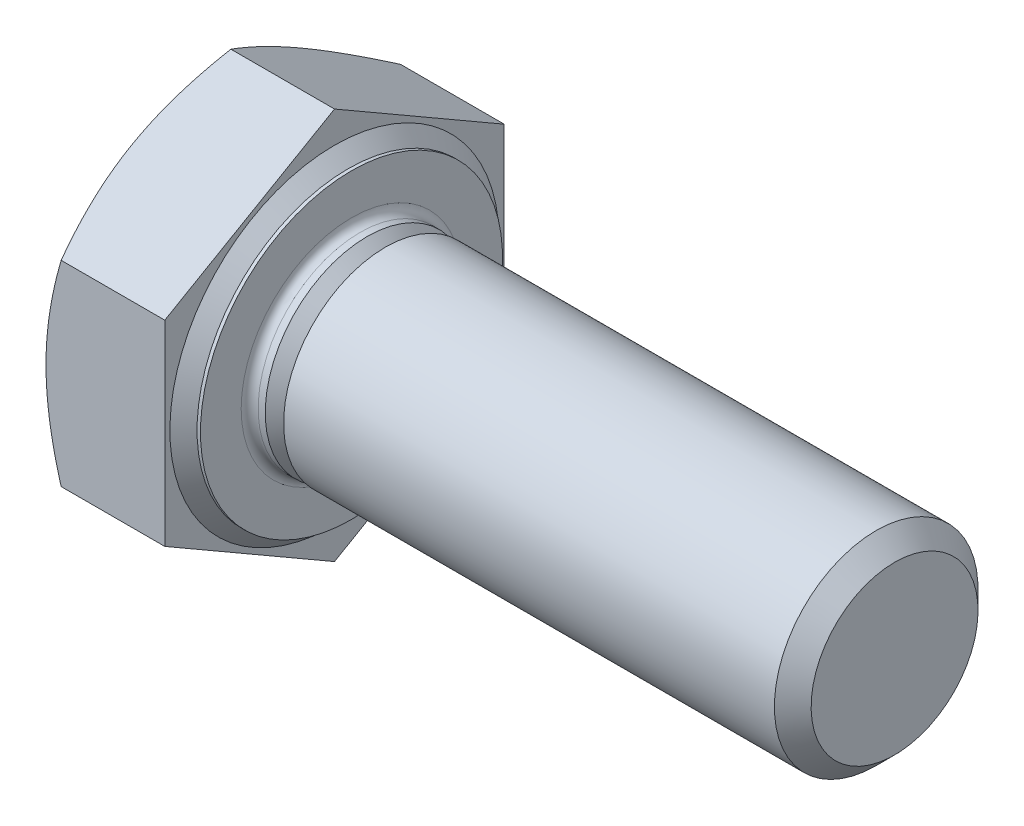
ISO-10303-21;
HEADER;
FILE_DESCRIPTION(('STEP AP214'),'2;1');
FILE_NAME('part.step','',(''),(''),'','','');
FILE_SCHEMA(('AUTOMOTIVE_DESIGN { 1 0 10303 214 1 1 1 1 }'));
ENDSEC;
DATA;
#1=APPLICATION_CONTEXT('core data for automotive mechanical design processes');
#2=APPLICATION_PROTOCOL_DEFINITION('international standard','automotive_design',2000,#1);
#3=PRODUCT_CONTEXT('',#1,'mechanical');
#4=PRODUCT('Part','Part','',(#3));
#5=PRODUCT_RELATED_PRODUCT_CATEGORY('part','',(#4));
#6=PRODUCT_DEFINITION_FORMATION('','',#4);
#7=PRODUCT_DEFINITION_CONTEXT('part definition',#1,'design');
#8=PRODUCT_DEFINITION('design','',#6,#7);
#9=PRODUCT_DEFINITION_SHAPE('','',#8);
#10=(LENGTH_UNIT() NAMED_UNIT(*) SI_UNIT(.MILLI.,.METRE.));
#11=(NAMED_UNIT(*) PLANE_ANGLE_UNIT() SI_UNIT($,.RADIAN.));
#12=(NAMED_UNIT(*) SI_UNIT($,.STERADIAN.) SOLID_ANGLE_UNIT());
#13=UNCERTAINTY_MEASURE_WITH_UNIT(LENGTH_MEASURE(1.E-05),#10,'distance_accuracy_value','');
#14=(GEOMETRIC_REPRESENTATION_CONTEXT(3) GLOBAL_UNCERTAINTY_ASSIGNED_CONTEXT((#13)) GLOBAL_UNIT_ASSIGNED_CONTEXT((#10,
#11,#12)) REPRESENTATION_CONTEXT('',''));
#15=CARTESIAN_POINT('',(0.,0.,0.));
#16=DIRECTION('',(0.,0.,1.));
#17=DIRECTION('',(1.,0.,0.));
#18=AXIS2_PLACEMENT_3D('',#15,#16,#17);
#19=CARTESIAN_POINT('',(0.,0.,0.));
#20=DIRECTION('',(-1.,0.,0.));
#21=DIRECTION('',(0.,0.,1.));
#22=AXIS2_PLACEMENT_3D('',#19,#20,#21);
#23=PLANE('',#22);
#24=DIRECTION('',(0.,-0.5,-0.866025403784439));
#25=VECTOR('',#24,1.);
#26=CARTESIAN_POINT('',(0.,5.77350269189626,0.));
#27=LINE('',#26,#25);
#28=CARTESIAN_POINT('',(0.,5.77350269189626,0.));
#29=VERTEX_POINT('',#28);
#30=CARTESIAN_POINT('',(0.,2.88675134594813,-5.));
#31=VERTEX_POINT('',#30);
#32=EDGE_CURVE('E11',#29,#31,#27,.T.);
#33=ORIENTED_EDGE('',*,*,#32,.F.);
#34=DIRECTION('',(0.,0.5,-0.866025403784439));
#35=VECTOR('',#34,1.);
#36=CARTESIAN_POINT('',(0.,2.88675134594813,5.));
#37=LINE('',#36,#35);
#38=CARTESIAN_POINT('',(0.,2.88675134594813,5.));
#39=VERTEX_POINT('',#38);
#40=EDGE_CURVE('E126',#39,#29,#37,.T.);
#41=ORIENTED_EDGE('',*,*,#40,.F.);
#42=DIRECTION('',(0.,1.,0.));
#43=VECTOR('',#42,1.);
#44=CARTESIAN_POINT('',(0.,-2.88675134594813,5.));
#45=LINE('',#44,#43);
#46=CARTESIAN_POINT('',(0.,-2.88675134594813,5.));
#47=VERTEX_POINT('',#46);
#48=EDGE_CURVE('E26',#47,#39,#45,.T.);
#49=ORIENTED_EDGE('',*,*,#48,.F.);
#50=DIRECTION('',(0.,0.5,0.866025403784439));
#51=VECTOR('',#50,1.);
#52=CARTESIAN_POINT('',(0.,-5.77350269189626,0.));
#53=LINE('',#52,#51);
#54=CARTESIAN_POINT('',(0.,-5.77350269189626,0.));
#55=VERTEX_POINT('',#54);
#56=EDGE_CURVE('E20',#55,#47,#53,.T.);
#57=ORIENTED_EDGE('',*,*,#56,.F.);
#58=DIRECTION('',(0.,-0.5,0.866025403784439));
#59=VECTOR('',#58,1.);
#60=CARTESIAN_POINT('',(0.,-2.88675134594812,-5.));
#61=LINE('',#60,#59);
#62=CARTESIAN_POINT('',(0.,-2.88675134594812,-5.));
#63=VERTEX_POINT('',#62);
#64=EDGE_CURVE('E192',#63,#55,#61,.T.);
#65=ORIENTED_EDGE('',*,*,#64,.F.);
#66=DIRECTION('',(0.,-1.,0.));
#67=VECTOR('',#66,1.);
#68=CARTESIAN_POINT('',(0.,2.88675134594813,-5.));
#69=LINE('',#68,#67);
#70=EDGE_CURVE('E160',#31,#63,#69,.T.);
#71=ORIENTED_EDGE('',*,*,#70,.F.);
#72=EDGE_LOOP('',(#33,#41,#49,#57,#65,#71));
#73=FACE_BOUND('',#72,.T.);
#74=CARTESIAN_POINT('',(0.,0.,0.));
#75=DIRECTION('',(-1.,0.,0.));
#76=DIRECTION('',(0.,1.,0.));
#77=AXIS2_PLACEMENT_3D('',#74,#75,#76);
#78=CIRCLE('',#77,4.85);
#79=CARTESIAN_POINT('',(0.,4.85,0.));
#80=VERTEX_POINT('',#79);
#81=EDGE_CURVE('E175',#80,#80,#78,.T.);
#82=ORIENTED_EDGE('',*,*,#81,.T.);
#83=EDGE_LOOP('',(#82));
#84=FACE_BOUND('',#83,.T.);
#85=ADVANCED_FACE('F16',(#73,#84),#23,.F.);
#86=CARTESIAN_POINT('',(-3.5,0.,0.));
#87=DIRECTION('',(-1.,0.,0.));
#88=DIRECTION('',(0.,0.,1.));
#89=AXIS2_PLACEMENT_3D('',#86,#87,#88);
#90=PLANE('',#89);
#91=CARTESIAN_POINT('',(-3.5,0.,0.));
#92=DIRECTION('',(1.,0.,0.));
#93=DIRECTION('',(0.,1.,0.));
#94=AXIS2_PLACEMENT_3D('',#91,#92,#93);
#95=CIRCLE('',#94,5.);
#96=CARTESIAN_POINT('',(-3.5,-4.3301270189222,-2.5));
#97=VERTEX_POINT('',#96);
#98=CARTESIAN_POINT('',(-3.5,0.,-5.));
#99=VERTEX_POINT('',#98);
#100=EDGE_CURVE('E183',#97,#99,#95,.T.);
#101=ORIENTED_EDGE('',*,*,#100,.F.);
#102=CARTESIAN_POINT('',(-3.5,0.,0.));
#103=DIRECTION('',(1.,0.,0.));
#104=DIRECTION('',(0.,1.,0.));
#105=AXIS2_PLACEMENT_3D('',#102,#103,#104);
#106=CIRCLE('',#105,5.);
#107=CARTESIAN_POINT('',(-3.5,-4.3301270189222,2.5));
#108=VERTEX_POINT('',#107);
#109=EDGE_CURVE('E149',#108,#97,#106,.T.);
#110=ORIENTED_EDGE('',*,*,#109,.F.);
#111=CARTESIAN_POINT('',(-3.5,0.,0.));
#112=DIRECTION('',(1.,0.,0.));
#113=DIRECTION('',(0.,1.,0.));
#114=AXIS2_PLACEMENT_3D('',#111,#112,#113);
#115=CIRCLE('',#114,5.);
#116=CARTESIAN_POINT('',(-3.5,0.,5.));
#117=VERTEX_POINT('',#116);
#118=EDGE_CURVE('E252',#117,#108,#115,.T.);
#119=ORIENTED_EDGE('',*,*,#118,.F.);
#120=CARTESIAN_POINT('',(-3.5,0.,0.));
#121=DIRECTION('',(1.,0.,0.));
#122=DIRECTION('',(0.,1.,0.));
#123=AXIS2_PLACEMENT_3D('',#120,#121,#122);
#124=CIRCLE('',#123,5.);
#125=CARTESIAN_POINT('',(-3.5,4.3301270189222,2.5));
#126=VERTEX_POINT('',#125);
#127=EDGE_CURVE('E167',#126,#117,#124,.T.);
#128=ORIENTED_EDGE('',*,*,#127,.F.);
#129=CARTESIAN_POINT('',(-3.5,0.,0.));
#130=DIRECTION('',(1.,0.,0.));
#131=DIRECTION('',(0.,1.,0.));
#132=AXIS2_PLACEMENT_3D('',#129,#130,#131);
#133=CIRCLE('',#132,5.);
#134=CARTESIAN_POINT('',(-3.5,4.3301270189222,-2.5));
#135=VERTEX_POINT('',#134);
#136=EDGE_CURVE('E197',#135,#126,#133,.T.);
#137=ORIENTED_EDGE('',*,*,#136,.F.);
#138=CARTESIAN_POINT('',(-3.5,0.,0.));
#139=DIRECTION('',(1.,0.,0.));
#140=DIRECTION('',(0.,1.,0.));
#141=AXIS2_PLACEMENT_3D('',#138,#139,#140);
#142=CIRCLE('',#141,5.);
#143=EDGE_CURVE('E103',#99,#135,#142,.T.);
#144=ORIENTED_EDGE('',*,*,#143,.F.);
#145=EDGE_LOOP('',(#101,#110,#119,#128,#137,#144));
#146=FACE_BOUND('',#145,.T.);
#147=ADVANCED_FACE('F304',(#146),#90,.T.);
#148=CARTESIAN_POINT('',(0.,4.3301270189222,-2.5));
#149=DIRECTION('',(0.,0.866025403784439,-0.5));
#150=DIRECTION('',(0.,-0.5,-0.866025403784439));
#151=AXIS2_PLACEMENT_3D('',#148,#149,#150);
#152=PLANE('',#151);
#153=CARTESIAN_POINT('',(-3.05255354137804,5.77499941813259,0.00259240588634483));
#154=CARTESIAN_POINT('',(-3.5,5.00060145011032,-1.33870422000633));
#155=CARTESIAN_POINT('',(-3.5,4.3301270189222,-2.5));
#156=CARTESIAN_POINT('',(-3.5,3.65965258773407,-3.66129577999367));
#157=CARTESIAN_POINT('',(-3.05255354137804,2.8852546197118,-5.00259240588634));
#158=(BOUNDED_CURVE() B_SPLINE_CURVE(2,(#153,#154,#155,#156,#157),.UNSPECIFIED.,.F.,
.F.) B_SPLINE_CURVE_WITH_KNOTS((3,2,3),(0.,2.9316581987571,5.8633163975142),
.UNSPECIFIED.) CURVE() GEOMETRIC_REPRESENTATION_ITEM() RATIONAL_B_SPLINE_CURVE((1.,
1.03802697460135,1.,1.03802697460134,1.)) REPRESENTATION_ITEM(''));
#159=CARTESIAN_POINT('',(-3.0534180126148,5.77350269189626,0.));
#160=VERTEX_POINT('',#159);
#161=EDGE_CURVE('E193',#160,#135,#158,.T.);
#162=ORIENTED_EDGE('',*,*,#161,.F.);
#163=DIRECTION('',(-1.,0.,0.));
#164=VECTOR('',#163,1.);
#165=CARTESIAN_POINT('',(0.,5.77350269189626,0.));
#166=LINE('',#165,#164);
#167=EDGE_CURVE('E129',#29,#160,#166,.T.);
#168=ORIENTED_EDGE('',*,*,#167,.F.);
#169=ORIENTED_EDGE('',*,*,#32,.T.);
#170=DIRECTION('',(-1.,0.,0.));
#171=VECTOR('',#170,1.);
#172=CARTESIAN_POINT('',(0.,2.88675134594813,-5.));
#173=LINE('',#172,#171);
#174=CARTESIAN_POINT('',(-3.0534180126148,2.88675134594813,-5.));
#175=VERTEX_POINT('',#174);
#176=EDGE_CURVE('E191',#31,#175,#173,.T.);
#177=ORIENTED_EDGE('',*,*,#176,.T.);
#178=CARTESIAN_POINT('',(-3.05255354137804,5.77499941813259,0.00259240588634483));
#179=CARTESIAN_POINT('',(-3.5,5.00060145011032,-1.33870422000633));
#180=CARTESIAN_POINT('',(-3.5,4.3301270189222,-2.5));
#181=CARTESIAN_POINT('',(-3.5,3.65965258773407,-3.66129577999367));
#182=CARTESIAN_POINT('',(-3.05255354137804,2.8852546197118,-5.00259240588634));
#183=(BOUNDED_CURVE() B_SPLINE_CURVE(2,(#178,#179,#180,#181,#182),.UNSPECIFIED.,.F.,
.F.) B_SPLINE_CURVE_WITH_KNOTS((3,2,3),(0.,2.9316581987571,5.8633163975142),
.UNSPECIFIED.) CURVE() GEOMETRIC_REPRESENTATION_ITEM() RATIONAL_B_SPLINE_CURVE((1.,
1.03802697460135,1.,1.03802697460134,1.)) REPRESENTATION_ITEM(''));
#184=EDGE_CURVE('E153',#135,#175,#183,.T.);
#185=ORIENTED_EDGE('',*,*,#184,.F.);
#186=EDGE_LOOP('',(#162,#168,#169,#177,#185));
#187=FACE_BOUND('',#186,.T.);
#188=ADVANCED_FACE('F309',(#187),#152,.T.);
#189=CARTESIAN_POINT('',(0.,0.,5.));
#190=DIRECTION('',(0.,0.,1.));
#191=DIRECTION('',(0.,1.,0.));
#192=AXIS2_PLACEMENT_3D('',#189,#190,#191);
#193=PLANE('',#192);
#194=CARTESIAN_POINT('',(-3.05255354137804,-2.88974479842079,5.));
#195=CARTESIAN_POINT('',(-3.5,-1.34094886237624,5.));
#196=CARTESIAN_POINT('',(-3.5,0.,5.));
#197=CARTESIAN_POINT('',(-3.5,1.34094886237624,5.));
#198=CARTESIAN_POINT('',(-3.05255354137804,2.88974479842079,5.));
#199=(BOUNDED_CURVE() B_SPLINE_CURVE(2,(#194,#195,#196,#197,#198),.UNSPECIFIED.,.F.,
.F.) B_SPLINE_CURVE_WITH_KNOTS((3,2,3),(0.,2.9316581987571,5.86331639751421),
.UNSPECIFIED.) CURVE() GEOMETRIC_REPRESENTATION_ITEM() RATIONAL_B_SPLINE_CURVE((1.,
1.03802697460133,1.,1.03802697460134,1.)) REPRESENTATION_ITEM(''));
#200=CARTESIAN_POINT('',(-3.0534180126148,-2.88675134594813,5.));
#201=VERTEX_POINT('',#200);
#202=EDGE_CURVE('E136',#201,#117,#199,.T.);
#203=ORIENTED_EDGE('',*,*,#202,.F.);
#204=DIRECTION('',(-1.,0.,0.));
#205=VECTOR('',#204,1.);
#206=CARTESIAN_POINT('',(0.,-2.88675134594813,5.));
#207=LINE('',#206,#205);
#208=EDGE_CURVE('E133',#47,#201,#207,.T.);
#209=ORIENTED_EDGE('',*,*,#208,.F.);
#210=ORIENTED_EDGE('',*,*,#48,.T.);
#211=DIRECTION('',(-1.,0.,0.));
#212=VECTOR('',#211,1.);
#213=CARTESIAN_POINT('',(0.,2.88675134594813,5.));
#214=LINE('',#213,#212);
#215=CARTESIAN_POINT('',(-3.0534180126148,2.88675134594813,5.));
#216=VERTEX_POINT('',#215);
#217=EDGE_CURVE('E158',#39,#216,#214,.T.);
#218=ORIENTED_EDGE('',*,*,#217,.T.);
#219=CARTESIAN_POINT('',(-3.05255354137804,-2.88974479842079,5.));
#220=CARTESIAN_POINT('',(-3.5,-1.34094886237624,5.));
#221=CARTESIAN_POINT('',(-3.5,0.,5.));
#222=CARTESIAN_POINT('',(-3.5,1.34094886237624,5.));
#223=CARTESIAN_POINT('',(-3.05255354137804,2.88974479842079,5.));
#224=(BOUNDED_CURVE() B_SPLINE_CURVE(2,(#219,#220,#221,#222,#223),.UNSPECIFIED.,.F.,
.F.) B_SPLINE_CURVE_WITH_KNOTS((3,2,3),(0.,2.9316581987571,5.86331639751421),
.UNSPECIFIED.) CURVE() GEOMETRIC_REPRESENTATION_ITEM() RATIONAL_B_SPLINE_CURVE((1.,
1.03802697460133,1.,1.03802697460134,1.)) REPRESENTATION_ITEM(''));
#225=EDGE_CURVE('E168',#117,#216,#224,.T.);
#226=ORIENTED_EDGE('',*,*,#225,.F.);
#227=EDGE_LOOP('',(#203,#209,#210,#218,#226));
#228=FACE_BOUND('',#227,.T.);
#229=ADVANCED_FACE('F18',(#228),#193,.T.);
#230=CARTESIAN_POINT('',(0.,4.3301270189222,2.5));
#231=DIRECTION('',(0.,0.866025403784439,0.5));
#232=DIRECTION('',(0.,0.5,-0.866025403784439));
#233=AXIS2_PLACEMENT_3D('',#230,#231,#232);
#234=PLANE('',#233);
#235=CARTESIAN_POINT('',(-3.05255354137804,2.8852546197118,5.00259240588635));
#236=CARTESIAN_POINT('',(-3.5,3.65965258773408,3.66129577999367));
#237=CARTESIAN_POINT('',(-3.5,4.3301270189222,2.5));
#238=CARTESIAN_POINT('',(-3.5,5.00060145011031,1.33870422000633));
#239=CARTESIAN_POINT('',(-3.05255354137804,5.77499941813259,-0.00259240588634483));
#240=(BOUNDED_CURVE() B_SPLINE_CURVE(2,(#235,#236,#237,#238,#239),.UNSPECIFIED.,.F.,
.F.) B_SPLINE_CURVE_WITH_KNOTS((3,2,3),(0.,2.9316581987571,5.8633163975142),
.UNSPECIFIED.) CURVE() GEOMETRIC_REPRESENTATION_ITEM() RATIONAL_B_SPLINE_CURVE((1.,
1.03802697460134,1.,1.03802697460134,1.)) REPRESENTATION_ITEM(''));
#241=EDGE_CURVE('E162',#216,#126,#240,.T.);
#242=ORIENTED_EDGE('',*,*,#241,.F.);
#243=ORIENTED_EDGE('',*,*,#217,.F.);
#244=ORIENTED_EDGE('',*,*,#40,.T.);
#245=ORIENTED_EDGE('',*,*,#167,.T.);
#246=CARTESIAN_POINT('',(-3.05255354137804,2.8852546197118,5.00259240588635));
#247=CARTESIAN_POINT('',(-3.5,3.65965258773408,3.66129577999367));
#248=CARTESIAN_POINT('',(-3.5,4.3301270189222,2.5));
#249=CARTESIAN_POINT('',(-3.5,5.00060145011031,1.33870422000633));
#250=CARTESIAN_POINT('',(-3.05255354137804,5.77499941813259,-0.00259240588634483));
#251=(BOUNDED_CURVE() B_SPLINE_CURVE(2,(#246,#247,#248,#249,#250),.UNSPECIFIED.,.F.,
.F.) B_SPLINE_CURVE_WITH_KNOTS((3,2,3),(0.,2.9316581987571,5.8633163975142),
.UNSPECIFIED.) CURVE() GEOMETRIC_REPRESENTATION_ITEM() RATIONAL_B_SPLINE_CURVE((1.,
1.03802697460134,1.,1.03802697460134,1.)) REPRESENTATION_ITEM(''));
#252=EDGE_CURVE('E177',#126,#160,#251,.T.);
#253=ORIENTED_EDGE('',*,*,#252,.F.);
#254=EDGE_LOOP('',(#242,#243,#244,#245,#253));
#255=FACE_BOUND('',#254,.T.);
#256=ADVANCED_FACE('F315',(#255),#234,.T.);
#257=CARTESIAN_POINT('',(0.,0.,-5.));
#258=DIRECTION('',(0.,0.,-1.));
#259=DIRECTION('',(0.,-1.,0.));
#260=AXIS2_PLACEMENT_3D('',#257,#258,#259);
#261=PLANE('',#260);
#262=CARTESIAN_POINT('',(-3.05255354137804,2.88974479842079,-5.));
#263=CARTESIAN_POINT('',(-3.5,1.34094886237624,-5.));
#264=CARTESIAN_POINT('',(-3.5,0.,-5.));
#265=CARTESIAN_POINT('',(-3.5,-1.34094886237624,-5.));
#266=CARTESIAN_POINT('',(-3.05255354137804,-2.88974479842079,-5.));
#267=(BOUNDED_CURVE() B_SPLINE_CURVE(2,(#262,#263,#264,#265,#266),.UNSPECIFIED.,.F.,
.F.) B_SPLINE_CURVE_WITH_KNOTS((3,2,3),(0.,2.9316581987571,5.8633163975142),
.UNSPECIFIED.) CURVE() GEOMETRIC_REPRESENTATION_ITEM() RATIONAL_B_SPLINE_CURVE((1.,
1.03802697460134,1.,1.03802697460134,1.)) REPRESENTATION_ITEM(''));
#268=CARTESIAN_POINT('',(-3.0534180126148,-2.88675134594813,-5.));
#269=VERTEX_POINT('',#268);
#270=EDGE_CURVE('E189',#99,#269,#267,.T.);
#271=ORIENTED_EDGE('',*,*,#270,.F.);
#272=CARTESIAN_POINT('',(-3.05255354137804,2.88974479842079,-5.));
#273=CARTESIAN_POINT('',(-3.5,1.34094886237624,-5.));
#274=CARTESIAN_POINT('',(-3.5,0.,-5.));
#275=CARTESIAN_POINT('',(-3.5,-1.34094886237624,-5.));
#276=CARTESIAN_POINT('',(-3.05255354137804,-2.88974479842079,-5.));
#277=(BOUNDED_CURVE() B_SPLINE_CURVE(2,(#272,#273,#274,#275,#276),.UNSPECIFIED.,.F.,
.F.) B_SPLINE_CURVE_WITH_KNOTS((3,2,3),(0.,2.9316581987571,5.8633163975142),
.UNSPECIFIED.) CURVE() GEOMETRIC_REPRESENTATION_ITEM() RATIONAL_B_SPLINE_CURVE((1.,
1.03802697460134,1.,1.03802697460134,1.)) REPRESENTATION_ITEM(''));
#278=EDGE_CURVE('E145',#175,#99,#277,.T.);
#279=ORIENTED_EDGE('',*,*,#278,.F.);
#280=ORIENTED_EDGE('',*,*,#176,.F.);
#281=ORIENTED_EDGE('',*,*,#70,.T.);
#282=DIRECTION('',(-1.,0.,0.));
#283=VECTOR('',#282,1.);
#284=CARTESIAN_POINT('',(0.,-2.88675134594812,-5.));
#285=LINE('',#284,#283);
#286=EDGE_CURVE('E139',#63,#269,#285,.T.);
#287=ORIENTED_EDGE('',*,*,#286,.T.);
#288=EDGE_LOOP('',(#271,#279,#280,#281,#287));
#289=FACE_BOUND('',#288,.T.);
#290=ADVANCED_FACE('F312',(#289),#261,.T.);
#291=CARTESIAN_POINT('',(0.,-4.3301270189222,-2.5));
#292=DIRECTION('',(0.,-0.866025403784439,-0.5));
#293=DIRECTION('',(0.,-0.5,0.866025403784439));
#294=AXIS2_PLACEMENT_3D('',#291,#292,#293);
#295=PLANE('',#294);
#296=CARTESIAN_POINT('',(-3.05255354137804,-2.88525461971179,-5.00259240588635));
#297=CARTESIAN_POINT('',(-3.5,-3.65965258773407,-3.66129577999367));
#298=CARTESIAN_POINT('',(-3.5,-4.33012701892219,-2.5));
#299=CARTESIAN_POINT('',(-3.5,-5.00060145011032,-1.33870422000633));
#300=CARTESIAN_POINT('',(-3.05255354137804,-5.77499941813259,0.00259240588634768));
#301=(BOUNDED_CURVE() B_SPLINE_CURVE(2,(#296,#297,#298,#299,#300),.UNSPECIFIED.,.F.,
.F.) B_SPLINE_CURVE_WITH_KNOTS((3,2,3),(0.,2.9316581987571,5.86331639751421),
.UNSPECIFIED.) CURVE() GEOMETRIC_REPRESENTATION_ITEM() RATIONAL_B_SPLINE_CURVE((1.,
1.03802697460133,1.,1.03802697460134,1.)) REPRESENTATION_ITEM(''));
#302=CARTESIAN_POINT('',(-3.0534180126148,-5.77350269189626,0.));
#303=VERTEX_POINT('',#302);
#304=EDGE_CURVE('E109',#97,#303,#301,.T.);
#305=ORIENTED_EDGE('',*,*,#304,.F.);
#306=CARTESIAN_POINT('',(-3.05255354137804,-2.88525461971179,-5.00259240588635));
#307=CARTESIAN_POINT('',(-3.5,-3.65965258773407,-3.66129577999367));
#308=CARTESIAN_POINT('',(-3.5,-4.33012701892219,-2.5));
#309=CARTESIAN_POINT('',(-3.5,-5.00060145011032,-1.33870422000633));
#310=CARTESIAN_POINT('',(-3.05255354137804,-5.77499941813259,0.00259240588634768));
#311=(BOUNDED_CURVE() B_SPLINE_CURVE(2,(#306,#307,#308,#309,#310),.UNSPECIFIED.,.F.,
.F.) B_SPLINE_CURVE_WITH_KNOTS((3,2,3),(0.,2.9316581987571,5.86331639751421),
.UNSPECIFIED.) CURVE() GEOMETRIC_REPRESENTATION_ITEM() RATIONAL_B_SPLINE_CURVE((1.,
1.03802697460133,1.,1.03802697460134,1.)) REPRESENTATION_ITEM(''));
#312=EDGE_CURVE('E190',#269,#97,#311,.T.);
#313=ORIENTED_EDGE('',*,*,#312,.F.);
#314=ORIENTED_EDGE('',*,*,#286,.F.);
#315=ORIENTED_EDGE('',*,*,#64,.T.);
#316=DIRECTION('',(-1.,0.,0.));
#317=VECTOR('',#316,1.);
#318=CARTESIAN_POINT('',(0.,-5.77350269189626,0.));
#319=LINE('',#318,#317);
#320=EDGE_CURVE('E143',#55,#303,#319,.T.);
#321=ORIENTED_EDGE('',*,*,#320,.T.);
#322=EDGE_LOOP('',(#305,#313,#314,#315,#321));
#323=FACE_BOUND('',#322,.T.);
#324=ADVANCED_FACE('F314',(#323),#295,.T.);
#325=CARTESIAN_POINT('',(0.,-4.3301270189222,2.5));
#326=DIRECTION('',(0.,-0.866025403784439,0.5));
#327=DIRECTION('',(0.,0.5,0.866025403784439));
#328=AXIS2_PLACEMENT_3D('',#325,#326,#327);
#329=PLANE('',#328);
#330=CARTESIAN_POINT('',(-3.05255354137804,-5.77499941813259,-0.00259240588634864));
#331=CARTESIAN_POINT('',(-3.5,-5.00060145011031,1.33870422000633));
#332=CARTESIAN_POINT('',(-3.5,-4.3301270189222,2.5));
#333=CARTESIAN_POINT('',(-3.5,-3.65965258773407,3.66129577999366));
#334=CARTESIAN_POINT('',(-3.05255354137804,-2.8852546197118,5.00259240588635));
#335=(BOUNDED_CURVE() B_SPLINE_CURVE(2,(#330,#331,#332,#333,#334),.UNSPECIFIED.,.F.,
.F.) B_SPLINE_CURVE_WITH_KNOTS((3,2,3),(0.,2.9316581987571,5.8633163975142),
.UNSPECIFIED.) CURVE() GEOMETRIC_REPRESENTATION_ITEM() RATIONAL_B_SPLINE_CURVE((1.,
1.03802697460134,1.,1.03802697460134,1.)) REPRESENTATION_ITEM(''));
#336=EDGE_CURVE('E182',#108,#201,#335,.T.);
#337=ORIENTED_EDGE('',*,*,#336,.F.);
#338=CARTESIAN_POINT('',(-3.05255354137804,-5.77499941813259,-0.00259240588634864));
#339=CARTESIAN_POINT('',(-3.5,-5.00060145011031,1.33870422000633));
#340=CARTESIAN_POINT('',(-3.5,-4.3301270189222,2.5));
#341=CARTESIAN_POINT('',(-3.5,-3.65965258773407,3.66129577999366));
#342=CARTESIAN_POINT('',(-3.05255354137804,-2.8852546197118,5.00259240588635));
#343=(BOUNDED_CURVE() B_SPLINE_CURVE(2,(#338,#339,#340,#341,#342),.UNSPECIFIED.,.F.,
.F.) B_SPLINE_CURVE_WITH_KNOTS((3,2,3),(0.,2.9316581987571,5.8633163975142),
.UNSPECIFIED.) CURVE() GEOMETRIC_REPRESENTATION_ITEM() RATIONAL_B_SPLINE_CURVE((1.,
1.03802697460134,1.,1.03802697460134,1.)) REPRESENTATION_ITEM(''));
#344=EDGE_CURVE('E220',#303,#108,#343,.T.);
#345=ORIENTED_EDGE('',*,*,#344,.F.);
#346=ORIENTED_EDGE('',*,*,#320,.F.);
#347=ORIENTED_EDGE('',*,*,#56,.T.);
#348=ORIENTED_EDGE('',*,*,#208,.T.);
#349=EDGE_LOOP('',(#337,#345,#346,#347,#348));
#350=FACE_BOUND('',#349,.T.);
#351=ADVANCED_FACE('F141',(#350),#329,.T.);
#352=CARTESIAN_POINT('',(-3.27627677068902,0.,0.));
#353=DIRECTION('',(1.,0.,0.));
#354=DIRECTION('',(0.,1.,0.));
#355=AXIS2_PLACEMENT_3D('',#352,#353,#354);
#356=CONICAL_SURFACE('',#355,5.3875,1.0471975511966);
#357=ORIENTED_EDGE('',*,*,#184,.T.);
#358=ORIENTED_EDGE('',*,*,#278,.T.);
#359=ORIENTED_EDGE('',*,*,#143,.T.);
#360=EDGE_LOOP('',(#357,#358,#359));
#361=FACE_BOUND('',#360,.T.);
#362=ADVANCED_FACE('F349',(#361),#356,.T.);
#363=CARTESIAN_POINT('',(-3.27627677068902,0.,0.));
#364=DIRECTION('',(1.,0.,0.));
#365=DIRECTION('',(0.,1.,0.));
#366=AXIS2_PLACEMENT_3D('',#363,#364,#365);
#367=CONICAL_SURFACE('',#366,5.3875,1.0471975511966);
#368=ORIENTED_EDGE('',*,*,#252,.T.);
#369=ORIENTED_EDGE('',*,*,#161,.T.);
#370=ORIENTED_EDGE('',*,*,#136,.T.);
#371=EDGE_LOOP('',(#368,#369,#370));
#372=FACE_BOUND('',#371,.T.);
#373=ADVANCED_FACE('F352',(#372),#367,.T.);
#374=CARTESIAN_POINT('',(-3.27627677068902,0.,0.));
#375=DIRECTION('',(1.,0.,0.));
#376=DIRECTION('',(0.,1.,0.));
#377=AXIS2_PLACEMENT_3D('',#374,#375,#376);
#378=CONICAL_SURFACE('',#377,5.3875,1.0471975511966);
#379=ORIENTED_EDGE('',*,*,#225,.T.);
#380=ORIENTED_EDGE('',*,*,#241,.T.);
#381=ORIENTED_EDGE('',*,*,#127,.T.);
#382=EDGE_LOOP('',(#379,#380,#381));
#383=FACE_BOUND('',#382,.T.);
#384=ADVANCED_FACE('F325',(#383),#378,.T.);
#385=CARTESIAN_POINT('',(-3.27627677068902,0.,0.));
#386=DIRECTION('',(1.,0.,0.));
#387=DIRECTION('',(0.,1.,0.));
#388=AXIS2_PLACEMENT_3D('',#385,#386,#387);
#389=CONICAL_SURFACE('',#388,5.3875,1.0471975511966);
#390=ORIENTED_EDGE('',*,*,#202,.T.);
#391=ORIENTED_EDGE('',*,*,#118,.T.);
#392=ORIENTED_EDGE('',*,*,#336,.T.);
#393=EDGE_LOOP('',(#390,#391,#392));
#394=FACE_BOUND('',#393,.T.);
#395=ADVANCED_FACE('F321',(#394),#389,.T.);
#396=CARTESIAN_POINT('',(-3.27627677068902,0.,0.));
#397=DIRECTION('',(1.,0.,0.));
#398=DIRECTION('',(0.,1.,0.));
#399=AXIS2_PLACEMENT_3D('',#396,#397,#398);
#400=CONICAL_SURFACE('',#399,5.3875,1.0471975511966);
#401=ORIENTED_EDGE('',*,*,#344,.T.);
#402=ORIENTED_EDGE('',*,*,#109,.T.);
#403=ORIENTED_EDGE('',*,*,#304,.T.);
#404=EDGE_LOOP('',(#401,#402,#403));
#405=FACE_BOUND('',#404,.T.);
#406=ADVANCED_FACE('F324',(#405),#400,.T.);
#407=CARTESIAN_POINT('',(-3.27627677068902,0.,0.));
#408=DIRECTION('',(1.,0.,0.));
#409=DIRECTION('',(0.,1.,0.));
#410=AXIS2_PLACEMENT_3D('',#407,#408,#409);
#411=CONICAL_SURFACE('',#410,5.3875,1.0471975511966);
#412=ORIENTED_EDGE('',*,*,#312,.T.);
#413=ORIENTED_EDGE('',*,*,#100,.T.);
#414=ORIENTED_EDGE('',*,*,#270,.T.);
#415=EDGE_LOOP('',(#412,#413,#414));
#416=FACE_BOUND('',#415,.T.);
#417=ADVANCED_FACE('F299',(#416),#411,.T.);
#418=CARTESIAN_POINT('',(16.5,1.229375,0.));
#419=DIRECTION('',(1.,0.,0.));
#420=DIRECTION('',(0.,1.,0.));
#421=AXIS2_PLACEMENT_3D('',#418,#419,#420);
#422=PLANE('',#421);
#423=CARTESIAN_POINT('',(16.5,0.,0.));
#424=DIRECTION('',(1.,0.,0.));
#425=DIRECTION('',(0.,1.,0.));
#426=AXIS2_PLACEMENT_3D('',#423,#424,#425);
#427=CIRCLE('',#426,2.45875);
#428=CARTESIAN_POINT('',(16.5,2.45875,0.));
#429=VERTEX_POINT('',#428);
#430=EDGE_CURVE('E267',#429,#429,#427,.T.);
#431=ORIENTED_EDGE('',*,*,#430,.T.);
#432=EDGE_LOOP('',(#431));
#433=FACE_BOUND('',#432,.T.);
#434=ADVANCED_FACE('F286',(#433),#422,.T.);
#435=CARTESIAN_POINT('',(16.229375,0.,0.));
#436=DIRECTION('',(-1.,0.,0.));
#437=DIRECTION('',(0.,1.,0.));
#438=AXIS2_PLACEMENT_3D('',#435,#436,#437);
#439=CONICAL_SURFACE('',#438,2.729375,0.785398163397448);
#440=CARTESIAN_POINT('',(15.95875,0.,0.));
#441=DIRECTION('',(1.,0.,0.));
#442=DIRECTION('',(0.,1.,0.));
#443=AXIS2_PLACEMENT_3D('',#440,#441,#442);
#444=CIRCLE('',#443,3.);
#445=CARTESIAN_POINT('',(15.95875,3.,0.));
#446=VERTEX_POINT('',#445);
#447=EDGE_CURVE('E272',#446,#446,#444,.T.);
#448=ORIENTED_EDGE('',*,*,#447,.T.);
#449=EDGE_LOOP('',(#448));
#450=FACE_BOUND('',#449,.T.);
#451=ORIENTED_EDGE('',*,*,#430,.F.);
#452=EDGE_LOOP('',(#451));
#453=FACE_BOUND('',#452,.T.);
#454=ADVANCED_FACE('F288',(#450,#453),#439,.T.);
#455=CARTESIAN_POINT('',(8.729375,0.,0.));
#456=DIRECTION('',(-1.,0.,0.));
#457=DIRECTION('',(0.,1.,0.));
#458=AXIS2_PLACEMENT_3D('',#455,#456,#457);
#459=CYLINDRICAL_SURFACE('',#458,3.);
#460=CARTESIAN_POINT('',(1.5,0.,0.));
#461=DIRECTION('',(1.,0.,0.));
#462=DIRECTION('',(0.,1.,0.));
#463=AXIS2_PLACEMENT_3D('',#460,#461,#462);
#464=CIRCLE('',#463,3.);
#465=CARTESIAN_POINT('',(1.5,3.,0.));
#466=VERTEX_POINT('',#465);
#467=EDGE_CURVE('E258',#466,#466,#464,.T.);
#468=ORIENTED_EDGE('',*,*,#467,.T.);
#469=EDGE_LOOP('',(#468));
#470=FACE_BOUND('',#469,.T.);
#471=ORIENTED_EDGE('',*,*,#447,.F.);
#472=EDGE_LOOP('',(#471));
#473=FACE_BOUND('',#472,.T.);
#474=ADVANCED_FACE('F290',(#470,#473),#459,.T.);
#475=CARTESIAN_POINT('',(1.5,2.729375,0.));
#476=DIRECTION('',(-1.,0.,0.));
#477=DIRECTION('',(0.,-1.,0.));
#478=AXIS2_PLACEMENT_3D('',#475,#476,#477);
#479=PLANE('',#478);
#480=CARTESIAN_POINT('',(1.5,0.,0.));
#481=DIRECTION('',(1.,0.,0.));
#482=DIRECTION('',(0.,1.,0.));
#483=AXIS2_PLACEMENT_3D('',#480,#481,#482);
#484=CIRCLE('',#483,2.45875);
#485=CARTESIAN_POINT('',(1.5,2.45875,0.));
#486=VERTEX_POINT('',#485);
#487=EDGE_CURVE('E257',#486,#486,#484,.T.);
#488=ORIENTED_EDGE('',*,*,#487,.T.);
#489=EDGE_LOOP('',(#488));
#490=FACE_BOUND('',#489,.T.);
#491=ORIENTED_EDGE('',*,*,#467,.F.);
#492=EDGE_LOOP('',(#491));
#493=FACE_BOUND('',#492,.T.);
#494=ADVANCED_FACE('F297',(#490,#493),#479,.T.);
#495=CARTESIAN_POINT('',(1.229375,0.,0.));
#496=DIRECTION('',(-1.,0.,0.));
#497=DIRECTION('',(0.,1.,0.));
#498=AXIS2_PLACEMENT_3D('',#495,#496,#497);
#499=CONICAL_SURFACE('',#498,2.729375,0.785398163397448);
#500=CARTESIAN_POINT('',(0.95875,0.,0.));
#501=DIRECTION('',(1.,0.,0.));
#502=DIRECTION('',(0.,1.,0.));
#503=AXIS2_PLACEMENT_3D('',#500,#501,#502);
#504=CIRCLE('',#503,3.);
#505=CARTESIAN_POINT('',(0.95875,3.,0.));
#506=VERTEX_POINT('',#505);
#507=EDGE_CURVE('E241',#506,#506,#504,.T.);
#508=ORIENTED_EDGE('',*,*,#507,.T.);
#509=EDGE_LOOP('',(#508));
#510=FACE_BOUND('',#509,.T.);
#511=ORIENTED_EDGE('',*,*,#487,.F.);
#512=EDGE_LOOP('',(#511));
#513=FACE_BOUND('',#512,.T.);
#514=ADVANCED_FACE('F327',(#510,#513),#499,.T.);
#515=CARTESIAN_POINT('',(0.129375,0.,0.));
#516=DIRECTION('',(-1.,0.,0.));
#517=DIRECTION('',(0.,1.,0.));
#518=AXIS2_PLACEMENT_3D('',#515,#516,#517);
#519=CYLINDRICAL_SURFACE('',#518,3.);
#520=ORIENTED_EDGE('',*,*,#507,.F.);
#521=EDGE_LOOP('',(#520));
#522=FACE_BOUND('',#521,.T.);
#523=CARTESIAN_POINT('',(0.75,0.,0.));
#524=DIRECTION('',(1.,0.,0.));
#525=DIRECTION('',(0.,1.,0.));
#526=AXIS2_PLACEMENT_3D('',#523,#524,#525);
#527=CIRCLE('',#526,3.);
#528=CARTESIAN_POINT('',(0.75,3.,0.));
#529=VERTEX_POINT('',#528);
#530=EDGE_CURVE('E214',#529,#529,#527,.T.);
#531=ORIENTED_EDGE('',*,*,#530,.T.);
#532=EDGE_LOOP('',(#531));
#533=FACE_BOUND('',#532,.T.);
#534=ADVANCED_FACE('F330',(#522,#533),#519,.T.);
#535=CARTESIAN_POINT('',(0.75,0.,0.));
#536=DIRECTION('',(1.,0.,0.));
#537=DIRECTION('',(0.,0.,-1.));
#538=AXIS2_PLACEMENT_3D('',#535,#536,#537);
#539=TOROIDAL_SURFACE('',#538,3.25,0.25);
#540=CARTESIAN_POINT('',(0.5,0.,0.));
#541=DIRECTION('',(1.,0.,0.));
#542=DIRECTION('',(0.,1.,0.));
#543=AXIS2_PLACEMENT_3D('',#540,#541,#542);
#544=CIRCLE('',#543,3.25);
#545=CARTESIAN_POINT('',(0.5,3.25,0.));
#546=VERTEX_POINT('',#545);
#547=EDGE_CURVE('E174',#546,#546,#544,.T.);
#548=ORIENTED_EDGE('',*,*,#547,.T.);
#549=EDGE_LOOP('',(#548));
#550=FACE_BOUND('',#549,.T.);
#551=ORIENTED_EDGE('',*,*,#530,.F.);
#552=EDGE_LOOP('',(#551));
#553=FACE_BOUND('',#552,.T.);
#554=ADVANCED_FACE('F338',(#550,#553),#539,.F.);
#555=CARTESIAN_POINT('',(0.5,3.85,0.));
#556=DIRECTION('',(1.,0.,0.));
#557=DIRECTION('',(0.,1.,0.));
#558=AXIS2_PLACEMENT_3D('',#555,#556,#557);
#559=PLANE('',#558);
#560=CARTESIAN_POINT('',(0.5,0.,0.));
#561=DIRECTION('',(1.,0.,0.));
#562=DIRECTION('',(0.,1.,0.));
#563=AXIS2_PLACEMENT_3D('',#560,#561,#562);
#564=CIRCLE('',#563,4.45);
#565=CARTESIAN_POINT('',(0.5,4.45,0.));
#566=VERTEX_POINT('',#565);
#567=EDGE_CURVE('E169',#566,#566,#564,.T.);
#568=ORIENTED_EDGE('',*,*,#567,.T.);
#569=EDGE_LOOP('',(#568));
#570=FACE_BOUND('',#569,.T.);
#571=ORIENTED_EDGE('',*,*,#547,.F.);
#572=EDGE_LOOP('',(#571));
#573=FACE_BOUND('',#572,.T.);
#574=ADVANCED_FACE('F336',(#570,#573),#559,.T.);
#575=CARTESIAN_POINT('',(0.45,0.,0.));
#576=DIRECTION('',(-1.,0.,0.));
#577=DIRECTION('',(0.,1.,0.));
#578=AXIS2_PLACEMENT_3D('',#575,#576,#577);
#579=CYLINDRICAL_SURFACE('',#578,4.45);
#580=CARTESIAN_POINT('',(0.4,0.,0.));
#581=DIRECTION('',(1.,0.,0.));
#582=DIRECTION('',(0.,1.,0.));
#583=AXIS2_PLACEMENT_3D('',#580,#581,#582);
#584=CIRCLE('',#583,4.45);
#585=CARTESIAN_POINT('',(0.4,4.45,0.));
#586=VERTEX_POINT('',#585);
#587=EDGE_CURVE('E235',#586,#586,#584,.T.);
#588=ORIENTED_EDGE('',*,*,#587,.T.);
#589=EDGE_LOOP('',(#588));
#590=FACE_BOUND('',#589,.T.);
#591=ORIENTED_EDGE('',*,*,#567,.F.);
#592=EDGE_LOOP('',(#591));
#593=FACE_BOUND('',#592,.T.);
#594=ADVANCED_FACE('F332',(#590,#593),#579,.T.);
#595=CARTESIAN_POINT('',(0.2,0.,0.));
#596=DIRECTION('',(-1.,0.,0.));
#597=DIRECTION('',(0.,1.,0.));
#598=AXIS2_PLACEMENT_3D('',#595,#596,#597);
#599=CONICAL_SURFACE('',#598,4.65,0.785398163397449);
#600=ORIENTED_EDGE('',*,*,#81,.F.);
#601=EDGE_LOOP('',(#600));
#602=FACE_BOUND('',#601,.T.);
#603=ORIENTED_EDGE('',*,*,#587,.F.);
#604=EDGE_LOOP('',(#603));
#605=FACE_BOUND('',#604,.T.);
#606=ADVANCED_FACE('F335',(#602,#605),#599,.T.);
#607=CLOSED_SHELL('',(#85,#147,#188,#229,#256,#290,#324,#351,#362,#373,#384,#395,#406,#417,#434,
#454,#474,#494,#514,#534,#554,#574,#594,#606));
#608=MANIFOLD_SOLID_BREP('B1',#607);
#609=ADVANCED_BREP_SHAPE_REPRESENTATION('',(#18,#608),#14);
#610=SHAPE_DEFINITION_REPRESENTATION(#9,#609);
ENDSEC;
END-ISO-10303-21;
